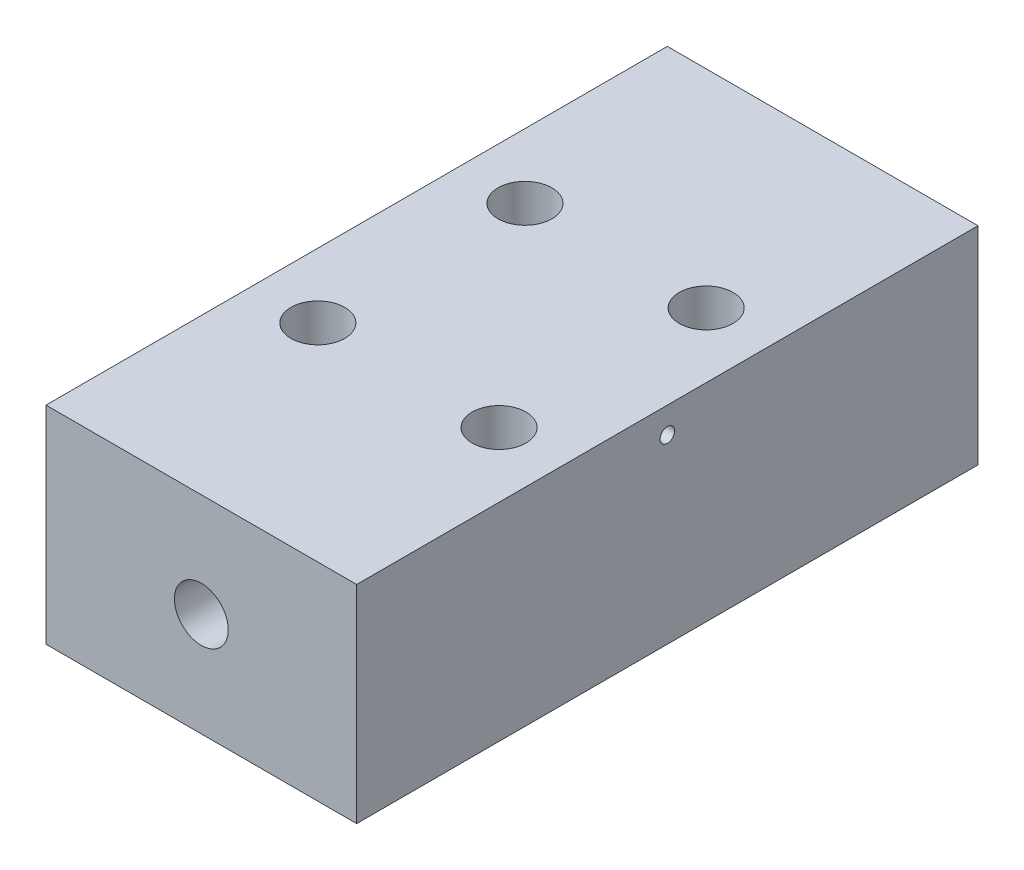
ISO-10303-21;
HEADER;
FILE_DESCRIPTION(('STEP AP214'),'2;1');
FILE_NAME('part.step','',(''),(''),'','','');
FILE_SCHEMA(('AUTOMOTIVE_DESIGN { 1 0 10303 214 1 1 1 1 }'));
ENDSEC;
DATA;
#1=APPLICATION_CONTEXT('core data for automotive mechanical design processes');
#2=APPLICATION_PROTOCOL_DEFINITION('international standard','automotive_design',2000,#1);
#3=PRODUCT_CONTEXT('',#1,'mechanical');
#4=PRODUCT('Part','Part','',(#3));
#5=PRODUCT_RELATED_PRODUCT_CATEGORY('part','',(#4));
#6=PRODUCT_DEFINITION_FORMATION('','',#4);
#7=PRODUCT_DEFINITION_CONTEXT('part definition',#1,'design');
#8=PRODUCT_DEFINITION('design','',#6,#7);
#9=PRODUCT_DEFINITION_SHAPE('','',#8);
#10=(LENGTH_UNIT() NAMED_UNIT(*) SI_UNIT(.MILLI.,.METRE.));
#11=(NAMED_UNIT(*) PLANE_ANGLE_UNIT() SI_UNIT($,.RADIAN.));
#12=(NAMED_UNIT(*) SI_UNIT($,.STERADIAN.) SOLID_ANGLE_UNIT());
#13=UNCERTAINTY_MEASURE_WITH_UNIT(LENGTH_MEASURE(1.E-05),#10,'distance_accuracy_value','');
#14=(GEOMETRIC_REPRESENTATION_CONTEXT(3) GLOBAL_UNCERTAINTY_ASSIGNED_CONTEXT((#13)) GLOBAL_UNIT_ASSIGNED_CONTEXT((#10,
#11,#12)) REPRESENTATION_CONTEXT('',''));
#15=CARTESIAN_POINT('',(0.,0.,0.));
#16=DIRECTION('',(0.,0.,1.));
#17=DIRECTION('',(1.,0.,0.));
#18=AXIS2_PLACEMENT_3D('',#15,#16,#17);
#19=CARTESIAN_POINT('',(-19.05,12.7,76.2));
#20=DIRECTION('',(1.,0.,0.));
#21=DIRECTION('',(0.,0.,-1.));
#22=AXIS2_PLACEMENT_3D('',#19,#20,#21);
#23=PLANE('',#22);
#24=CARTESIAN_POINT('',(-19.05,9.525,38.1));
#25=DIRECTION('',(-1.,0.,0.));
#26=DIRECTION('',(0.,0.,1.));
#27=AXIS2_PLACEMENT_3D('',#24,#25,#26);
#28=CIRCLE('',#27,0.889000000000003);
#29=CARTESIAN_POINT('',(-19.05,9.525,38.989));
#30=VERTEX_POINT('',#29);
#31=EDGE_CURVE('E147',#30,#30,#28,.T.);
#32=ORIENTED_EDGE('',*,*,#31,.F.);
#33=EDGE_LOOP('',(#32));
#34=FACE_BOUND('',#33,.T.);
#35=DIRECTION('',(0.,-1.,0.));
#36=VECTOR('',#35,1.);
#37=CARTESIAN_POINT('',(-19.05,12.7,0.));
#38=LINE('',#37,#36);
#39=CARTESIAN_POINT('',(-19.05,12.7,0.));
#40=VERTEX_POINT('',#39);
#41=CARTESIAN_POINT('',(-19.05,-12.7,0.));
#42=VERTEX_POINT('',#41);
#43=EDGE_CURVE('E97',#40,#42,#38,.T.);
#44=ORIENTED_EDGE('',*,*,#43,.T.);
#45=DIRECTION('',(0.,0.,-1.));
#46=VECTOR('',#45,1.);
#47=CARTESIAN_POINT('',(-19.05,-12.7,76.2));
#48=LINE('',#47,#46);
#49=CARTESIAN_POINT('',(-19.05,-12.7,76.2));
#50=VERTEX_POINT('',#49);
#51=EDGE_CURVE('E11',#50,#42,#48,.T.);
#52=ORIENTED_EDGE('',*,*,#51,.F.);
#53=DIRECTION('',(0.,-1.,0.));
#54=VECTOR('',#53,1.);
#55=CARTESIAN_POINT('',(-19.05,12.7,76.2));
#56=LINE('',#55,#54);
#57=CARTESIAN_POINT('',(-19.05,12.7,76.2));
#58=VERTEX_POINT('',#57);
#59=EDGE_CURVE('E85',#58,#50,#56,.T.);
#60=ORIENTED_EDGE('',*,*,#59,.F.);
#61=DIRECTION('',(0.,0.,-1.));
#62=VECTOR('',#61,1.);
#63=CARTESIAN_POINT('',(-19.05,12.7,76.2));
#64=LINE('',#63,#62);
#65=EDGE_CURVE('E93',#58,#40,#64,.T.);
#66=ORIENTED_EDGE('',*,*,#65,.T.);
#67=EDGE_LOOP('',(#44,#52,#60,#66));
#68=FACE_BOUND('',#67,.T.);
#69=ADVANCED_FACE('F34',(#34,#68),#23,.F.);
#70=CARTESIAN_POINT('',(-19.05,-12.7,76.2));
#71=DIRECTION('',(0.,1.,0.));
#72=DIRECTION('',(0.,0.,1.));
#73=AXIS2_PLACEMENT_3D('',#70,#71,#72);
#74=PLANE('',#73);
#75=CARTESIAN_POINT('',(11.1125,-12.7,50.8));
#76=DIRECTION('',(0.,1.,0.));
#77=DIRECTION('',(-1.,0.,0.));
#78=AXIS2_PLACEMENT_3D('',#75,#76,#77);
#79=CIRCLE('',#78,3.302);
#80=CARTESIAN_POINT('',(7.81049999999999,-12.7,50.8));
#81=VERTEX_POINT('',#80);
#82=EDGE_CURVE('E132',#81,#81,#79,.T.);
#83=ORIENTED_EDGE('',*,*,#82,.T.);
#84=EDGE_LOOP('',(#83));
#85=FACE_BOUND('',#84,.T.);
#86=CARTESIAN_POINT('',(-11.1125,-12.7,50.8));
#87=DIRECTION('',(0.,1.,0.));
#88=DIRECTION('',(-1.,0.,0.));
#89=AXIS2_PLACEMENT_3D('',#86,#87,#88);
#90=CIRCLE('',#89,3.302);
#91=CARTESIAN_POINT('',(-14.4145,-12.7,50.8));
#92=VERTEX_POINT('',#91);
#93=EDGE_CURVE('E126',#92,#92,#90,.T.);
#94=ORIENTED_EDGE('',*,*,#93,.T.);
#95=EDGE_LOOP('',(#94));
#96=FACE_BOUND('',#95,.T.);
#97=CARTESIAN_POINT('',(11.1125,-12.7,25.4));
#98=DIRECTION('',(0.,1.,0.));
#99=DIRECTION('',(-1.,0.,0.));
#100=AXIS2_PLACEMENT_3D('',#97,#98,#99);
#101=CIRCLE('',#100,3.302);
#102=CARTESIAN_POINT('',(7.81049999999999,-12.7,25.4));
#103=VERTEX_POINT('',#102);
#104=EDGE_CURVE('E120',#103,#103,#101,.T.);
#105=ORIENTED_EDGE('',*,*,#104,.T.);
#106=EDGE_LOOP('',(#105));
#107=FACE_BOUND('',#106,.T.);
#108=CARTESIAN_POINT('',(-11.1125,-12.7,25.4));
#109=DIRECTION('',(0.,1.,0.));
#110=DIRECTION('',(-1.,0.,0.));
#111=AXIS2_PLACEMENT_3D('',#108,#109,#110);
#112=CIRCLE('',#111,3.302);
#113=CARTESIAN_POINT('',(-14.4145,-12.7,25.4));
#114=VERTEX_POINT('',#113);
#115=EDGE_CURVE('E114',#114,#114,#112,.T.);
#116=ORIENTED_EDGE('',*,*,#115,.T.);
#117=EDGE_LOOP('',(#116));
#118=FACE_BOUND('',#117,.T.);
#119=DIRECTION('',(1.,0.,0.));
#120=VECTOR('',#119,1.);
#121=CARTESIAN_POINT('',(-19.05,-12.7,0.));
#122=LINE('',#121,#120);
#123=CARTESIAN_POINT('',(19.05,-12.7,0.));
#124=VERTEX_POINT('',#123);
#125=EDGE_CURVE('E89',#42,#124,#122,.T.);
#126=ORIENTED_EDGE('',*,*,#125,.T.);
#127=DIRECTION('',(0.,0.,-1.));
#128=VECTOR('',#127,1.);
#129=CARTESIAN_POINT('',(19.05,-12.7,76.2));
#130=LINE('',#129,#128);
#131=CARTESIAN_POINT('',(19.05,-12.7,76.2));
#132=VERTEX_POINT('',#131);
#133=EDGE_CURVE('E42',#132,#124,#130,.T.);
#134=ORIENTED_EDGE('',*,*,#133,.F.);
#135=DIRECTION('',(1.,0.,0.));
#136=VECTOR('',#135,1.);
#137=CARTESIAN_POINT('',(-19.05,-12.7,76.2));
#138=LINE('',#137,#136);
#139=EDGE_CURVE('E80',#50,#132,#138,.T.);
#140=ORIENTED_EDGE('',*,*,#139,.F.);
#141=ORIENTED_EDGE('',*,*,#51,.T.);
#142=EDGE_LOOP('',(#126,#134,#140,#141));
#143=FACE_BOUND('',#142,.T.);
#144=ADVANCED_FACE('F88',(#85,#96,#107,#118,#143),#74,.F.);
#145=CARTESIAN_POINT('',(19.05,12.7,76.2));
#146=DIRECTION('',(-1.,0.,0.));
#147=DIRECTION('',(0.,0.,1.));
#148=AXIS2_PLACEMENT_3D('',#145,#146,#147);
#149=PLANE('',#148);
#150=CARTESIAN_POINT('',(19.05,9.525,38.1));
#151=DIRECTION('',(1.,0.,0.));
#152=DIRECTION('',(0.,0.,-1.));
#153=AXIS2_PLACEMENT_3D('',#150,#151,#152);
#154=CIRCLE('',#153,0.889000000000003);
#155=CARTESIAN_POINT('',(19.05,9.525,37.211));
#156=VERTEX_POINT('',#155);
#157=EDGE_CURVE('E141',#156,#156,#154,.T.);
#158=ORIENTED_EDGE('',*,*,#157,.F.);
#159=EDGE_LOOP('',(#158));
#160=FACE_BOUND('',#159,.T.);
#161=DIRECTION('',(0.,1.,0.));
#162=VECTOR('',#161,1.);
#163=CARTESIAN_POINT('',(19.05,12.7,0.));
#164=LINE('',#163,#162);
#165=CARTESIAN_POINT('',(19.05,12.7,0.));
#166=VERTEX_POINT('',#165);
#167=EDGE_CURVE('E67',#124,#166,#164,.T.);
#168=ORIENTED_EDGE('',*,*,#167,.T.);
#169=DIRECTION('',(0.,0.,-1.));
#170=VECTOR('',#169,1.);
#171=CARTESIAN_POINT('',(19.05,12.7,76.2));
#172=LINE('',#171,#170);
#173=CARTESIAN_POINT('',(19.05,12.7,76.2));
#174=VERTEX_POINT('',#173);
#175=EDGE_CURVE('E90',#174,#166,#172,.T.);
#176=ORIENTED_EDGE('',*,*,#175,.F.);
#177=DIRECTION('',(0.,1.,0.));
#178=VECTOR('',#177,1.);
#179=CARTESIAN_POINT('',(19.05,12.7,76.2));
#180=LINE('',#179,#178);
#181=EDGE_CURVE('E83',#132,#174,#180,.T.);
#182=ORIENTED_EDGE('',*,*,#181,.F.);
#183=ORIENTED_EDGE('',*,*,#133,.T.);
#184=EDGE_LOOP('',(#168,#176,#182,#183));
#185=FACE_BOUND('',#184,.T.);
#186=ADVANCED_FACE('F91',(#160,#185),#149,.F.);
#187=CARTESIAN_POINT('',(-19.05,12.7,76.2));
#188=DIRECTION('',(0.,-1.,0.));
#189=DIRECTION('',(1.,0.,0.));
#190=AXIS2_PLACEMENT_3D('',#187,#188,#189);
#191=PLANE('',#190);
#192=CARTESIAN_POINT('',(11.1125,12.7,50.8));
#193=DIRECTION('',(0.,1.,0.));
#194=DIRECTION('',(-1.,0.,0.));
#195=AXIS2_PLACEMENT_3D('',#192,#193,#194);
#196=CIRCLE('',#195,3.302);
#197=CARTESIAN_POINT('',(7.81049999999999,12.7,50.8));
#198=VERTEX_POINT('',#197);
#199=EDGE_CURVE('E135',#198,#198,#196,.T.);
#200=ORIENTED_EDGE('',*,*,#199,.F.);
#201=EDGE_LOOP('',(#200));
#202=FACE_BOUND('',#201,.T.);
#203=CARTESIAN_POINT('',(-11.1125,12.7,50.8));
#204=DIRECTION('',(0.,1.,0.));
#205=DIRECTION('',(-1.,0.,0.));
#206=AXIS2_PLACEMENT_3D('',#203,#204,#205);
#207=CIRCLE('',#206,3.302);
#208=CARTESIAN_POINT('',(-14.4145,12.7,50.8));
#209=VERTEX_POINT('',#208);
#210=EDGE_CURVE('E129',#209,#209,#207,.T.);
#211=ORIENTED_EDGE('',*,*,#210,.F.);
#212=EDGE_LOOP('',(#211));
#213=FACE_BOUND('',#212,.T.);
#214=CARTESIAN_POINT('',(11.1125,12.7,25.4));
#215=DIRECTION('',(0.,1.,0.));
#216=DIRECTION('',(-1.,0.,0.));
#217=AXIS2_PLACEMENT_3D('',#214,#215,#216);
#218=CIRCLE('',#217,3.302);
#219=CARTESIAN_POINT('',(7.81049999999999,12.7,25.4));
#220=VERTEX_POINT('',#219);
#221=EDGE_CURVE('E123',#220,#220,#218,.T.);
#222=ORIENTED_EDGE('',*,*,#221,.F.);
#223=EDGE_LOOP('',(#222));
#224=FACE_BOUND('',#223,.T.);
#225=CARTESIAN_POINT('',(-11.1125,12.7,25.4));
#226=DIRECTION('',(0.,1.,0.));
#227=DIRECTION('',(-1.,0.,0.));
#228=AXIS2_PLACEMENT_3D('',#225,#226,#227);
#229=CIRCLE('',#228,3.302);
#230=CARTESIAN_POINT('',(-14.4145,12.7,25.4));
#231=VERTEX_POINT('',#230);
#232=EDGE_CURVE('E117',#231,#231,#229,.T.);
#233=ORIENTED_EDGE('',*,*,#232,.F.);
#234=EDGE_LOOP('',(#233));
#235=FACE_BOUND('',#234,.T.);
#236=DIRECTION('',(-1.,0.,0.));
#237=VECTOR('',#236,1.);
#238=CARTESIAN_POINT('',(-19.05,12.7,0.));
#239=LINE('',#238,#237);
#240=EDGE_CURVE('E73',#166,#40,#239,.T.);
#241=ORIENTED_EDGE('',*,*,#240,.T.);
#242=ORIENTED_EDGE('',*,*,#65,.F.);
#243=DIRECTION('',(-1.,0.,0.));
#244=VECTOR('',#243,1.);
#245=CARTESIAN_POINT('',(-19.05,12.7,76.2));
#246=LINE('',#245,#244);
#247=EDGE_CURVE('E50',#174,#58,#246,.T.);
#248=ORIENTED_EDGE('',*,*,#247,.F.);
#249=ORIENTED_EDGE('',*,*,#175,.T.);
#250=EDGE_LOOP('',(#241,#242,#248,#249));
#251=FACE_BOUND('',#250,.T.);
#252=ADVANCED_FACE('F105',(#202,#213,#224,#235,#251),#191,.F.);
#253=CARTESIAN_POINT('',(0.,0.,76.2));
#254=DIRECTION('',(0.,0.,1.));
#255=DIRECTION('',(1.,0.,0.));
#256=AXIS2_PLACEMENT_3D('',#253,#254,#255);
#257=PLANE('',#256);
#258=CARTESIAN_POINT('',(0.,0.,76.2));
#259=DIRECTION('',(0.,0.,1.));
#260=DIRECTION('',(1.,0.,0.));
#261=AXIS2_PLACEMENT_3D('',#258,#259,#260);
#262=CIRCLE('',#261,3.302);
#263=CARTESIAN_POINT('',(3.302,0.,76.2));
#264=VERTEX_POINT('',#263);
#265=EDGE_CURVE('E111',#264,#264,#262,.T.);
#266=ORIENTED_EDGE('',*,*,#265,.F.);
#267=EDGE_LOOP('',(#266));
#268=FACE_BOUND('',#267,.T.);
#269=ORIENTED_EDGE('',*,*,#59,.T.);
#270=ORIENTED_EDGE('',*,*,#139,.T.);
#271=ORIENTED_EDGE('',*,*,#181,.T.);
#272=ORIENTED_EDGE('',*,*,#247,.T.);
#273=EDGE_LOOP('',(#269,#270,#271,#272));
#274=FACE_BOUND('',#273,.T.);
#275=ADVANCED_FACE('F81',(#268,#274),#257,.T.);
#276=CARTESIAN_POINT('',(0.,0.,0.));
#277=DIRECTION('',(0.,0.,1.));
#278=DIRECTION('',(1.,0.,0.));
#279=AXIS2_PLACEMENT_3D('',#276,#277,#278);
#280=PLANE('',#279);
#281=CARTESIAN_POINT('',(0.,0.,0.));
#282=DIRECTION('',(0.,0.,1.));
#283=DIRECTION('',(1.,0.,0.));
#284=AXIS2_PLACEMENT_3D('',#281,#282,#283);
#285=CIRCLE('',#284,3.302);
#286=CARTESIAN_POINT('',(3.302,0.,0.));
#287=VERTEX_POINT('',#286);
#288=EDGE_CURVE('E100',#287,#287,#285,.T.);
#289=ORIENTED_EDGE('',*,*,#288,.T.);
#290=EDGE_LOOP('',(#289));
#291=FACE_BOUND('',#290,.T.);
#292=ORIENTED_EDGE('',*,*,#43,.F.);
#293=ORIENTED_EDGE('',*,*,#240,.F.);
#294=ORIENTED_EDGE('',*,*,#167,.F.);
#295=ORIENTED_EDGE('',*,*,#125,.F.);
#296=EDGE_LOOP('',(#292,#293,#294,#295));
#297=FACE_BOUND('',#296,.T.);
#298=ADVANCED_FACE('F108',(#291,#297),#280,.F.);
#299=CARTESIAN_POINT('',(0.,0.,0.));
#300=DIRECTION('',(0.,0.,1.));
#301=DIRECTION('',(1.,0.,0.));
#302=AXIS2_PLACEMENT_3D('',#299,#300,#301);
#303=CYLINDRICAL_SURFACE('',#302,3.302);
#304=CARTESIAN_POINT('',(3.302,0.,0.));
#305=CARTESIAN_POINT('',(3.302,0.,0.79375));
#306=CARTESIAN_POINT('',(3.302,0.,1.5875));
#307=CARTESIAN_POINT('',(3.302,0.,3.175));
#308=CARTESIAN_POINT('',(3.302,0.,3.96875));
#309=CARTESIAN_POINT('',(3.302,0.,5.55625));
#310=CARTESIAN_POINT('',(3.302,0.,6.35));
#311=CARTESIAN_POINT('',(3.302,0.,7.9375));
#312=CARTESIAN_POINT('',(3.302,0.,8.73125));
#313=CARTESIAN_POINT('',(3.302,0.,10.31875));
#314=CARTESIAN_POINT('',(3.302,0.,11.1125));
#315=CARTESIAN_POINT('',(3.302,0.,12.7));
#316=CARTESIAN_POINT('',(3.302,0.,13.49375));
#317=CARTESIAN_POINT('',(3.302,0.,15.08125));
#318=CARTESIAN_POINT('',(3.302,0.,15.875));
#319=CARTESIAN_POINT('',(3.302,0.,17.4625));
#320=CARTESIAN_POINT('',(3.302,0.,18.25625));
#321=CARTESIAN_POINT('',(3.302,0.,19.84375));
#322=CARTESIAN_POINT('',(3.302,0.,20.6375));
#323=CARTESIAN_POINT('',(3.302,0.,22.225));
#324=CARTESIAN_POINT('',(3.302,0.,23.01875));
#325=CARTESIAN_POINT('',(3.302,0.,24.60625));
#326=CARTESIAN_POINT('',(3.302,0.,25.4));
#327=CARTESIAN_POINT('',(3.302,0.,26.9875));
#328=CARTESIAN_POINT('',(3.302,0.,27.78125));
#329=CARTESIAN_POINT('',(3.302,0.,29.36875));
#330=CARTESIAN_POINT('',(3.302,0.,30.1625));
#331=CARTESIAN_POINT('',(3.302,0.,31.75));
#332=CARTESIAN_POINT('',(3.302,0.,32.54375));
#333=CARTESIAN_POINT('',(3.302,0.,34.13125));
#334=CARTESIAN_POINT('',(3.302,0.,34.925));
#335=CARTESIAN_POINT('',(3.302,0.,36.5125));
#336=CARTESIAN_POINT('',(3.302,0.,37.30625));
#337=CARTESIAN_POINT('',(3.302,0.,38.89375));
#338=CARTESIAN_POINT('',(3.302,0.,39.6875));
#339=CARTESIAN_POINT('',(3.302,0.,41.275));
#340=CARTESIAN_POINT('',(3.302,0.,42.06875));
#341=CARTESIAN_POINT('',(3.302,0.,43.65625));
#342=CARTESIAN_POINT('',(3.302,0.,44.45));
#343=CARTESIAN_POINT('',(3.302,0.,46.0375));
#344=CARTESIAN_POINT('',(3.302,0.,46.83125));
#345=CARTESIAN_POINT('',(3.302,0.,48.41875));
#346=CARTESIAN_POINT('',(3.302,0.,49.2125));
#347=CARTESIAN_POINT('',(3.302,0.,50.8));
#348=CARTESIAN_POINT('',(3.302,0.,51.59375));
#349=CARTESIAN_POINT('',(3.302,0.,53.18125));
#350=CARTESIAN_POINT('',(3.302,0.,53.975));
#351=CARTESIAN_POINT('',(3.302,0.,55.5625));
#352=CARTESIAN_POINT('',(3.302,0.,56.35625));
#353=CARTESIAN_POINT('',(3.302,0.,57.94375));
#354=CARTESIAN_POINT('',(3.302,0.,58.7375));
#355=CARTESIAN_POINT('',(3.302,0.,60.325));
#356=CARTESIAN_POINT('',(3.302,0.,61.11875));
#357=CARTESIAN_POINT('',(3.302,0.,62.70625));
#358=CARTESIAN_POINT('',(3.302,0.,63.5));
#359=CARTESIAN_POINT('',(3.302,0.,65.0875));
#360=CARTESIAN_POINT('',(3.302,0.,65.88125));
#361=CARTESIAN_POINT('',(3.302,0.,67.46875));
#362=CARTESIAN_POINT('',(3.302,0.,68.2625));
#363=CARTESIAN_POINT('',(3.302,0.,69.85));
#364=CARTESIAN_POINT('',(3.302,0.,70.64375));
#365=CARTESIAN_POINT('',(3.302,0.,72.23125));
#366=CARTESIAN_POINT('',(3.302,0.,73.025));
#367=CARTESIAN_POINT('',(3.302,0.,74.6125));
#368=CARTESIAN_POINT('',(3.302,0.,75.40625));
#369=CARTESIAN_POINT('',(3.302,0.,76.2));
#370=B_SPLINE_CURVE_WITH_KNOTS('',3,(#304,#305,#306,#307,#308,#309,#310,#311,#312,#313,#314,
#315,#316,#317,#318,#319,#320,#321,#322,#323,#324,#325,#326,#327,#328,#329,#330,#331,#332,#333,
#334,#335,#336,#337,#338,#339,#340,#341,#342,#343,#344,#345,#346,#347,#348,#349,#350,#351,#352,
#353,#354,#355,#356,#357,#358,#359,#360,#361,#362,#363,#364,#365,#366,#367,#368,#369),
.UNSPECIFIED.,.F.,.F.,(4,2,2,2,2,2,2,2,2,2,2,2,2,2,2,2,2,2,2,2,2,2,2,2,2,2,2,2,2,2,2,2,4),(0.,
2.38125,4.7625,7.14375,9.525,11.90625,14.2875,16.66875,19.05,21.43125,23.8125,26.19375,28.575,
30.95625,33.3375,35.71875,38.1,40.48125,42.8625,45.24375,47.625,50.00625,52.3875,54.76875,57.15,
59.53125,61.9125,64.29375,66.675,69.05625,71.4375,73.81875,76.2),.UNSPECIFIED.);
#371=EDGE_CURVE('BSEAM179',#287,#264,#370,.T.);
#372=ORIENTED_EDGE('',*,*,#288,.F.);
#373=ORIENTED_EDGE('',*,*,#265,.T.);
#374=ORIENTED_EDGE('',*,*,#371,.T.);
#375=ORIENTED_EDGE('',*,*,#371,.F.);
#376=EDGE_LOOP('',(#372,#374,#373,#375));
#377=FACE_BOUND('',#376,.T.);
#378=ADVANCED_FACE('F179',(#377),#303,.F.);
#379=CARTESIAN_POINT('',(-11.1125,-12.7,25.4));
#380=DIRECTION('',(0.,1.,0.));
#381=DIRECTION('',(-1.,0.,0.));
#382=AXIS2_PLACEMENT_3D('',#379,#380,#381);
#383=CYLINDRICAL_SURFACE('',#382,3.302);
#384=ORIENTED_EDGE('',*,*,#115,.F.);
#385=EDGE_LOOP('',(#384));
#386=FACE_BOUND('',#385,.T.);
#387=ORIENTED_EDGE('',*,*,#232,.T.);
#388=EDGE_LOOP('',(#387));
#389=FACE_BOUND('',#388,.T.);
#390=ADVANCED_FACE('F186',(#386,#389),#383,.F.);
#391=CARTESIAN_POINT('',(11.1125,-12.7,25.4));
#392=DIRECTION('',(0.,1.,0.));
#393=DIRECTION('',(-1.,0.,0.));
#394=AXIS2_PLACEMENT_3D('',#391,#392,#393);
#395=CYLINDRICAL_SURFACE('',#394,3.302);
#396=ORIENTED_EDGE('',*,*,#104,.F.);
#397=EDGE_LOOP('',(#396));
#398=FACE_BOUND('',#397,.T.);
#399=ORIENTED_EDGE('',*,*,#221,.T.);
#400=EDGE_LOOP('',(#399));
#401=FACE_BOUND('',#400,.T.);
#402=ADVANCED_FACE('F190',(#398,#401),#395,.F.);
#403=CARTESIAN_POINT('',(-11.1125,-12.7,50.8));
#404=DIRECTION('',(0.,1.,0.));
#405=DIRECTION('',(-1.,0.,0.));
#406=AXIS2_PLACEMENT_3D('',#403,#404,#405);
#407=CYLINDRICAL_SURFACE('',#406,3.302);
#408=ORIENTED_EDGE('',*,*,#93,.F.);
#409=EDGE_LOOP('',(#408));
#410=FACE_BOUND('',#409,.T.);
#411=ORIENTED_EDGE('',*,*,#210,.T.);
#412=EDGE_LOOP('',(#411));
#413=FACE_BOUND('',#412,.T.);
#414=ADVANCED_FACE('F194',(#410,#413),#407,.F.);
#415=CARTESIAN_POINT('',(11.1125,-12.7,50.8));
#416=DIRECTION('',(0.,1.,0.));
#417=DIRECTION('',(-1.,0.,0.));
#418=AXIS2_PLACEMENT_3D('',#415,#416,#417);
#419=CYLINDRICAL_SURFACE('',#418,3.302);
#420=ORIENTED_EDGE('',*,*,#82,.F.);
#421=EDGE_LOOP('',(#420));
#422=FACE_BOUND('',#421,.T.);
#423=ORIENTED_EDGE('',*,*,#199,.T.);
#424=EDGE_LOOP('',(#423));
#425=FACE_BOUND('',#424,.T.);
#426=ADVANCED_FACE('F198',(#422,#425),#419,.F.);
#427=CARTESIAN_POINT('',(6.35,9.525,38.1));
#428=DIRECTION('',(1.,0.,0.));
#429=DIRECTION('',(0.,0.,-1.));
#430=AXIS2_PLACEMENT_3D('',#427,#428,#429);
#431=CYLINDRICAL_SURFACE('',#430,0.889000000000003);
#432=CARTESIAN_POINT('',(6.35,9.525,38.1));
#433=DIRECTION('',(1.,0.,0.));
#434=DIRECTION('',(0.,0.,-1.));
#435=AXIS2_PLACEMENT_3D('',#432,#433,#434);
#436=CIRCLE('',#435,0.889000000000003);
#437=CARTESIAN_POINT('',(6.35,9.525,37.211));
#438=VERTEX_POINT('',#437);
#439=EDGE_CURVE('E138',#438,#438,#436,.T.);
#440=ORIENTED_EDGE('',*,*,#439,.F.);
#441=EDGE_LOOP('',(#440));
#442=FACE_BOUND('',#441,.T.);
#443=ORIENTED_EDGE('',*,*,#157,.T.);
#444=EDGE_LOOP('',(#443));
#445=FACE_BOUND('',#444,.T.);
#446=ADVANCED_FACE('F202',(#442,#445),#431,.F.);
#447=CARTESIAN_POINT('',(6.35,9.525,38.1));
#448=DIRECTION('',(1.,0.,0.));
#449=DIRECTION('',(0.,0.,-1.));
#450=AXIS2_PLACEMENT_3D('',#447,#448,#449);
#451=PLANE('',#450);
#452=ORIENTED_EDGE('',*,*,#439,.T.);
#453=EDGE_LOOP('',(#452));
#454=FACE_BOUND('',#453,.T.);
#455=ADVANCED_FACE('F158',(#454),#451,.T.);
#456=CARTESIAN_POINT('',(-6.35,9.525,38.1));
#457=DIRECTION('',(-1.,0.,0.));
#458=DIRECTION('',(0.,0.,1.));
#459=AXIS2_PLACEMENT_3D('',#456,#457,#458);
#460=CYLINDRICAL_SURFACE('',#459,0.889000000000003);
#461=CARTESIAN_POINT('',(-6.35,9.525,38.1));
#462=DIRECTION('',(-1.,0.,0.));
#463=DIRECTION('',(0.,0.,1.));
#464=AXIS2_PLACEMENT_3D('',#461,#462,#463);
#465=CIRCLE('',#464,0.889000000000003);
#466=CARTESIAN_POINT('',(-6.35,9.525,38.989));
#467=VERTEX_POINT('',#466);
#468=EDGE_CURVE('E144',#467,#467,#465,.T.);
#469=ORIENTED_EDGE('',*,*,#468,.F.);
#470=EDGE_LOOP('',(#469));
#471=FACE_BOUND('',#470,.T.);
#472=ORIENTED_EDGE('',*,*,#31,.T.);
#473=EDGE_LOOP('',(#472));
#474=FACE_BOUND('',#473,.T.);
#475=ADVANCED_FACE('F155',(#471,#474),#460,.F.);
#476=CARTESIAN_POINT('',(-6.35,9.525,38.1));
#477=DIRECTION('',(-1.,0.,0.));
#478=DIRECTION('',(0.,0.,1.));
#479=AXIS2_PLACEMENT_3D('',#476,#477,#478);
#480=PLANE('',#479);
#481=ORIENTED_EDGE('',*,*,#468,.T.);
#482=EDGE_LOOP('',(#481));
#483=FACE_BOUND('',#482,.T.);
#484=ADVANCED_FACE('F153',(#483),#480,.T.);
#485=CLOSED_SHELL('',(#69,#144,#186,#252,#275,#298,#378,#390,#402,#414,#426,#446,#455,#475,#484));
#486=MANIFOLD_SOLID_BREP('B2',#485);
#487=ADVANCED_BREP_SHAPE_REPRESENTATION('',(#18,#486),#14);
#488=SHAPE_DEFINITION_REPRESENTATION(#9,#487);
ENDSEC;
END-ISO-10303-21;
